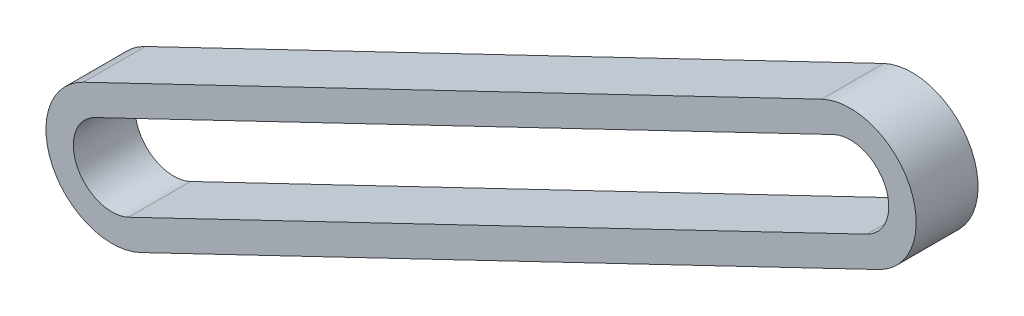
ISO-10303-21;
HEADER;
FILE_DESCRIPTION(('STEP AP214'),'2;1');
FILE_NAME('part.step','',(''),(''),'','','');
FILE_SCHEMA(('AUTOMOTIVE_DESIGN { 1 0 10303 214 1 1 1 1 }'));
ENDSEC;
DATA;
#1=APPLICATION_CONTEXT('core data for automotive mechanical design processes');
#2=APPLICATION_PROTOCOL_DEFINITION('international standard','automotive_design',2000,#1);
#3=PRODUCT_CONTEXT('',#1,'mechanical');
#4=PRODUCT('Part','Part','',(#3));
#5=PRODUCT_RELATED_PRODUCT_CATEGORY('part','',(#4));
#6=PRODUCT_DEFINITION_FORMATION('','',#4);
#7=PRODUCT_DEFINITION_CONTEXT('part definition',#1,'design');
#8=PRODUCT_DEFINITION('design','',#6,#7);
#9=PRODUCT_DEFINITION_SHAPE('','',#8);
#10=(LENGTH_UNIT() NAMED_UNIT(*) SI_UNIT(.MILLI.,.METRE.));
#11=(NAMED_UNIT(*) PLANE_ANGLE_UNIT() SI_UNIT($,.RADIAN.));
#12=(NAMED_UNIT(*) SI_UNIT($,.STERADIAN.) SOLID_ANGLE_UNIT());
#13=UNCERTAINTY_MEASURE_WITH_UNIT(LENGTH_MEASURE(1.E-05),#10,'distance_accuracy_value','');
#14=(GEOMETRIC_REPRESENTATION_CONTEXT(3) GLOBAL_UNCERTAINTY_ASSIGNED_CONTEXT((#13)) GLOBAL_UNIT_ASSIGNED_CONTEXT((#10,
#11,#12)) REPRESENTATION_CONTEXT('',''));
#15=CARTESIAN_POINT('',(0.,0.,0.));
#16=DIRECTION('',(0.,0.,1.));
#17=DIRECTION('',(1.,0.,0.));
#18=AXIS2_PLACEMENT_3D('',#15,#16,#17);
#19=CARTESIAN_POINT('',(0.,0.,-3.));
#20=DIRECTION('',(0.,0.,1.));
#21=DIRECTION('',(1.,0.,0.));
#22=AXIS2_PLACEMENT_3D('',#19,#20,#21);
#23=CYLINDRICAL_SURFACE('',#22,3.2);
#24=CARTESIAN_POINT('',(0.,0.,0.));
#25=DIRECTION('',(0.,0.,1.));
#26=DIRECTION('',(1.,0.,0.));
#27=AXIS2_PLACEMENT_3D('',#24,#25,#26);
#28=CIRCLE('',#27,3.2);
#29=CARTESIAN_POINT('',(-1.38491820855128,2.88478795678696,0.));
#30=VERTEX_POINT('',#29);
#31=CARTESIAN_POINT('',(1.38491820855131,-2.88478795678695,0.));
#32=VERTEX_POINT('',#31);
#33=EDGE_CURVE('E135',#30,#32,#28,.T.);
#34=ORIENTED_EDGE('',*,*,#33,.F.);
#35=DIRECTION('',(0.,0.,1.));
#36=VECTOR('',#35,1.);
#37=CARTESIAN_POINT('',(-1.38491820855128,2.88478795678696,-3.));
#38=LINE('',#37,#36);
#39=CARTESIAN_POINT('',(-1.38491820855128,2.88478795678696,-3.));
#40=VERTEX_POINT('',#39);
#41=EDGE_CURVE('E11',#40,#30,#38,.T.);
#42=ORIENTED_EDGE('',*,*,#41,.F.);
#43=CARTESIAN_POINT('',(0.,0.,-3.));
#44=DIRECTION('',(0.,0.,1.));
#45=DIRECTION('',(1.,0.,0.));
#46=AXIS2_PLACEMENT_3D('',#43,#44,#45);
#47=CIRCLE('',#46,3.2);
#48=CARTESIAN_POINT('',(1.38491820855131,-2.88478795678695,-3.));
#49=VERTEX_POINT('',#48);
#50=EDGE_CURVE('E139',#40,#49,#47,.T.);
#51=ORIENTED_EDGE('',*,*,#50,.T.);
#52=DIRECTION('',(0.,0.,1.));
#53=VECTOR('',#52,1.);
#54=CARTESIAN_POINT('',(1.38491820855131,-2.88478795678695,-3.));
#55=LINE('',#54,#53);
#56=EDGE_CURVE('E40',#49,#32,#55,.T.);
#57=ORIENTED_EDGE('',*,*,#56,.T.);
#58=EDGE_LOOP('',(#34,#42,#51,#57));
#59=FACE_BOUND('',#58,.T.);
#60=ADVANCED_FACE('F37',(#59),#23,.T.);
#61=CARTESIAN_POINT('',(-1.38491820855128,2.88478795678696,-3.));
#62=DIRECTION('',(-0.43278694017228,0.901496236495925,0.));
#63=DIRECTION('',(-0.901496236495925,-0.43278694017228,0.));
#64=AXIS2_PLACEMENT_3D('',#61,#62,#63);
#65=PLANE('',#64);
#66=DIRECTION('',(-0.901496236495924,-0.432786940172279,0.));
#67=VECTOR('',#66,1.);
#68=CARTESIAN_POINT('',(-1.38491820855128,2.88478795678696,0.));
#69=LINE('',#68,#67);
#70=CARTESIAN_POINT('',(34.4150817914487,20.0715180072542,0.));
#71=VERTEX_POINT('',#70);
#72=EDGE_CURVE('E143',#71,#30,#69,.T.);
#73=ORIENTED_EDGE('',*,*,#72,.F.);
#74=DIRECTION('',(0.,0.,1.));
#75=VECTOR('',#74,1.);
#76=CARTESIAN_POINT('',(34.4150817914487,20.0715180072542,-3.));
#77=LINE('',#76,#75);
#78=CARTESIAN_POINT('',(34.4150817914487,20.0715180072542,-3.));
#79=VERTEX_POINT('',#78);
#80=EDGE_CURVE('E45',#79,#71,#77,.T.);
#81=ORIENTED_EDGE('',*,*,#80,.F.);
#82=DIRECTION('',(-0.901496236495924,-0.432786940172279,0.));
#83=VECTOR('',#82,1.);
#84=CARTESIAN_POINT('',(-1.38491820855128,2.88478795678696,-3.));
#85=LINE('',#84,#83);
#86=EDGE_CURVE('E149',#79,#40,#85,.T.);
#87=ORIENTED_EDGE('',*,*,#86,.T.);
#88=ORIENTED_EDGE('',*,*,#41,.T.);
#89=EDGE_LOOP('',(#73,#81,#87,#88));
#90=FACE_BOUND('',#89,.T.);
#91=ADVANCED_FACE('F175',(#90),#65,.T.);
#92=CARTESIAN_POINT('',(35.8,17.1867300504672,-3.));
#93=DIRECTION('',(0.,0.,1.));
#94=DIRECTION('',(1.,0.,0.));
#95=AXIS2_PLACEMENT_3D('',#92,#93,#94);
#96=CYLINDRICAL_SURFACE('',#95,3.2);
#97=CARTESIAN_POINT('',(35.8,17.1867300504672,0.));
#98=DIRECTION('',(0.,0.,1.));
#99=DIRECTION('',(1.,0.,0.));
#100=AXIS2_PLACEMENT_3D('',#97,#98,#99);
#101=CIRCLE('',#100,3.2);
#102=CARTESIAN_POINT('',(37.1849182085513,14.3019420936803,0.));
#103=VERTEX_POINT('',#102);
#104=EDGE_CURVE('E157',#103,#71,#101,.T.);
#105=ORIENTED_EDGE('',*,*,#104,.F.);
#106=DIRECTION('',(0.,0.,1.));
#107=VECTOR('',#106,1.);
#108=CARTESIAN_POINT('',(37.1849182085513,14.3019420936803,-3.));
#109=LINE('',#108,#107);
#110=CARTESIAN_POINT('',(37.1849182085513,14.3019420936803,-3.));
#111=VERTEX_POINT('',#110);
#112=EDGE_CURVE('E162',#111,#103,#109,.T.);
#113=ORIENTED_EDGE('',*,*,#112,.F.);
#114=CARTESIAN_POINT('',(35.8,17.1867300504672,-3.));
#115=DIRECTION('',(0.,0.,1.));
#116=DIRECTION('',(1.,0.,0.));
#117=AXIS2_PLACEMENT_3D('',#114,#115,#116);
#118=CIRCLE('',#117,3.2);
#119=EDGE_CURVE('E146',#111,#79,#118,.T.);
#120=ORIENTED_EDGE('',*,*,#119,.T.);
#121=ORIENTED_EDGE('',*,*,#80,.T.);
#122=EDGE_LOOP('',(#105,#113,#120,#121));
#123=FACE_BOUND('',#122,.T.);
#124=ADVANCED_FACE('F179',(#123),#96,.T.);
#125=CARTESIAN_POINT('',(1.38491820855131,-2.88478795678695,-3.));
#126=DIRECTION('',(0.43278694017228,-0.901496236495924,0.));
#127=DIRECTION('',(0.901496236495925,0.43278694017228,0.));
#128=AXIS2_PLACEMENT_3D('',#125,#126,#127);
#129=PLANE('',#128);
#130=DIRECTION('',(0.901496236495924,0.43278694017228,0.));
#131=VECTOR('',#130,1.);
#132=CARTESIAN_POINT('',(1.38491820855131,-2.88478795678695,0.));
#133=LINE('',#132,#131);
#134=EDGE_CURVE('E154',#32,#103,#133,.T.);
#135=ORIENTED_EDGE('',*,*,#134,.F.);
#136=ORIENTED_EDGE('',*,*,#56,.F.);
#137=DIRECTION('',(0.901496236495924,0.43278694017228,0.));
#138=VECTOR('',#137,1.);
#139=CARTESIAN_POINT('',(1.38491820855131,-2.88478795678695,-3.));
#140=LINE('',#139,#138);
#141=EDGE_CURVE('E142',#49,#111,#140,.T.);
#142=ORIENTED_EDGE('',*,*,#141,.T.);
#143=ORIENTED_EDGE('',*,*,#112,.T.);
#144=EDGE_LOOP('',(#135,#136,#142,#143));
#145=FACE_BOUND('',#144,.T.);
#146=ADVANCED_FACE('F170',(#145),#129,.T.);
#147=CARTESIAN_POINT('',(0.,0.,-3.));
#148=DIRECTION('',(0.,0.,1.));
#149=DIRECTION('',(1.,0.,0.));
#150=AXIS2_PLACEMENT_3D('',#147,#148,#149);
#151=PLANE('',#150);
#152=DIRECTION('',(-0.901496236495924,-0.43278694017228,0.));
#153=VECTOR('',#152,1.);
#154=CARTESIAN_POINT('',(-0.810177152002494,1.68760095472038,-3.));
#155=LINE('',#154,#153);
#156=CARTESIAN_POINT('',(34.9898228479975,18.8743310051876,-3.));
#157=VERTEX_POINT('',#156);
#158=CARTESIAN_POINT('',(-0.810177152002494,1.68760095472038,-3.));
#159=VERTEX_POINT('',#158);
#160=EDGE_CURVE('E110',#157,#159,#155,.T.);
#161=ORIENTED_EDGE('',*,*,#160,.T.);
#162=CARTESIAN_POINT('',(0.,0.,-3.));
#163=DIRECTION('',(0.,0.,1.));
#164=DIRECTION('',(1.,0.,0.));
#165=AXIS2_PLACEMENT_3D('',#162,#163,#164);
#166=CIRCLE('',#165,1.872);
#167=CARTESIAN_POINT('',(0.81017715200252,-1.68760095472036,-3.));
#168=VERTEX_POINT('',#167);
#169=EDGE_CURVE('E104',#159,#168,#166,.T.);
#170=ORIENTED_EDGE('',*,*,#169,.T.);
#171=DIRECTION('',(0.901496236495924,0.432786940172279,0.));
#172=VECTOR('',#171,1.);
#173=CARTESIAN_POINT('',(0.81017715200252,-1.68760095472036,-3.));
#174=LINE('',#173,#172);
#175=CARTESIAN_POINT('',(36.6101771520025,15.4991290957468,-3.));
#176=VERTEX_POINT('',#175);
#177=EDGE_CURVE('E113',#168,#176,#174,.T.);
#178=ORIENTED_EDGE('',*,*,#177,.T.);
#179=CARTESIAN_POINT('',(35.8,17.1867300504672,-3.));
#180=DIRECTION('',(0.,0.,1.));
#181=DIRECTION('',(1.,0.,0.));
#182=AXIS2_PLACEMENT_3D('',#179,#180,#181);
#183=CIRCLE('',#182,1.872);
#184=EDGE_CURVE('E53',#176,#157,#183,.T.);
#185=ORIENTED_EDGE('',*,*,#184,.T.);
#186=EDGE_LOOP('',(#161,#170,#178,#185));
#187=FACE_BOUND('',#186,.T.);
#188=ORIENTED_EDGE('',*,*,#50,.F.);
#189=ORIENTED_EDGE('',*,*,#86,.F.);
#190=ORIENTED_EDGE('',*,*,#119,.F.);
#191=ORIENTED_EDGE('',*,*,#141,.F.);
#192=EDGE_LOOP('',(#188,#189,#190,#191));
#193=FACE_BOUND('',#192,.T.);
#194=ADVANCED_FACE('F117',(#187,#193),#151,.F.);
#195=CARTESIAN_POINT('',(0.,0.,0.));
#196=DIRECTION('',(0.,0.,1.));
#197=DIRECTION('',(1.,0.,0.));
#198=AXIS2_PLACEMENT_3D('',#195,#196,#197);
#199=PLANE('',#198);
#200=CARTESIAN_POINT('',(0.,0.,0.));
#201=DIRECTION('',(0.,0.,1.));
#202=DIRECTION('',(1.,0.,0.));
#203=AXIS2_PLACEMENT_3D('',#200,#201,#202);
#204=CIRCLE('',#203,1.872);
#205=CARTESIAN_POINT('',(-0.810177152002494,1.68760095472038,0.));
#206=VERTEX_POINT('',#205);
#207=CARTESIAN_POINT('',(0.81017715200252,-1.68760095472036,0.));
#208=VERTEX_POINT('',#207);
#209=EDGE_CURVE('E61',#206,#208,#204,.T.);
#210=ORIENTED_EDGE('',*,*,#209,.F.);
#211=DIRECTION('',(-0.901496236495924,-0.43278694017228,0.));
#212=VECTOR('',#211,1.);
#213=CARTESIAN_POINT('',(-0.810177152002494,1.68760095472038,0.));
#214=LINE('',#213,#212);
#215=CARTESIAN_POINT('',(34.9898228479975,18.8743310051876,0.));
#216=VERTEX_POINT('',#215);
#217=EDGE_CURVE('E120',#216,#206,#214,.T.);
#218=ORIENTED_EDGE('',*,*,#217,.F.);
#219=CARTESIAN_POINT('',(35.8,17.1867300504672,0.));
#220=DIRECTION('',(0.,0.,1.));
#221=DIRECTION('',(1.,0.,0.));
#222=AXIS2_PLACEMENT_3D('',#219,#220,#221);
#223=CIRCLE('',#222,1.872);
#224=CARTESIAN_POINT('',(36.6101771520025,15.4991290957469,0.));
#225=VERTEX_POINT('',#224);
#226=EDGE_CURVE('E123',#225,#216,#223,.T.);
#227=ORIENTED_EDGE('',*,*,#226,.F.);
#228=DIRECTION('',(0.901496236495924,0.432786940172279,0.));
#229=VECTOR('',#228,1.);
#230=CARTESIAN_POINT('',(0.81017715200252,-1.68760095472036,0.));
#231=LINE('',#230,#229);
#232=EDGE_CURVE('E129',#208,#225,#231,.T.);
#233=ORIENTED_EDGE('',*,*,#232,.F.);
#234=EDGE_LOOP('',(#210,#218,#227,#233));
#235=FACE_BOUND('',#234,.T.);
#236=ORIENTED_EDGE('',*,*,#33,.T.);
#237=ORIENTED_EDGE('',*,*,#134,.T.);
#238=ORIENTED_EDGE('',*,*,#104,.T.);
#239=ORIENTED_EDGE('',*,*,#72,.T.);
#240=EDGE_LOOP('',(#236,#237,#238,#239));
#241=FACE_BOUND('',#240,.T.);
#242=ADVANCED_FACE('F172',(#235,#241),#199,.T.);
#243=CARTESIAN_POINT('',(0.,0.,-3.));
#244=DIRECTION('',(0.,0.,1.));
#245=DIRECTION('',(1.,0.,0.));
#246=AXIS2_PLACEMENT_3D('',#243,#244,#245);
#247=CYLINDRICAL_SURFACE('',#246,1.872);
#248=ORIENTED_EDGE('',*,*,#209,.T.);
#249=DIRECTION('',(0.,0.,1.));
#250=VECTOR('',#249,1.);
#251=CARTESIAN_POINT('',(0.81017715200252,-1.68760095472036,-3.));
#252=LINE('',#251,#250);
#253=EDGE_CURVE('E100',#168,#208,#252,.T.);
#254=ORIENTED_EDGE('',*,*,#253,.F.);
#255=ORIENTED_EDGE('',*,*,#169,.F.);
#256=DIRECTION('',(0.,0.,1.));
#257=VECTOR('',#256,1.);
#258=CARTESIAN_POINT('',(-0.810177152002494,1.68760095472038,-3.));
#259=LINE('',#258,#257);
#260=EDGE_CURVE('E133',#159,#206,#259,.T.);
#261=ORIENTED_EDGE('',*,*,#260,.T.);
#262=EDGE_LOOP('',(#248,#254,#255,#261));
#263=FACE_BOUND('',#262,.T.);
#264=ADVANCED_FACE('F102',(#263),#247,.F.);
#265=CARTESIAN_POINT('',(-0.810177152002494,1.68760095472038,-3.));
#266=DIRECTION('',(-0.43278694017228,0.901496236495924,0.));
#267=DIRECTION('',(-0.901496236495925,-0.43278694017228,0.));
#268=AXIS2_PLACEMENT_3D('',#265,#266,#267);
#269=PLANE('',#268);
#270=ORIENTED_EDGE('',*,*,#217,.T.);
#271=ORIENTED_EDGE('',*,*,#260,.F.);
#272=ORIENTED_EDGE('',*,*,#160,.F.);
#273=DIRECTION('',(0.,0.,1.));
#274=VECTOR('',#273,1.);
#275=CARTESIAN_POINT('',(34.9898228479975,18.8743310051876,-3.));
#276=LINE('',#275,#274);
#277=EDGE_CURVE('E136',#157,#216,#276,.T.);
#278=ORIENTED_EDGE('',*,*,#277,.T.);
#279=EDGE_LOOP('',(#270,#271,#272,#278));
#280=FACE_BOUND('',#279,.T.);
#281=ADVANCED_FACE('F232',(#280),#269,.F.);
#282=CARTESIAN_POINT('',(35.8,17.1867300504672,-3.));
#283=DIRECTION('',(0.,0.,1.));
#284=DIRECTION('',(1.,0.,0.));
#285=AXIS2_PLACEMENT_3D('',#282,#283,#284);
#286=CYLINDRICAL_SURFACE('',#285,1.872);
#287=ORIENTED_EDGE('',*,*,#226,.T.);
#288=ORIENTED_EDGE('',*,*,#277,.F.);
#289=ORIENTED_EDGE('',*,*,#184,.F.);
#290=DIRECTION('',(0.,0.,1.));
#291=VECTOR('',#290,1.);
#292=CARTESIAN_POINT('',(36.6101771520025,15.4991290957469,-3.));
#293=LINE('',#292,#291);
#294=EDGE_CURVE('E109',#176,#225,#293,.T.);
#295=ORIENTED_EDGE('',*,*,#294,.T.);
#296=EDGE_LOOP('',(#287,#288,#289,#295));
#297=FACE_BOUND('',#296,.T.);
#298=ADVANCED_FACE('F241',(#297),#286,.F.);
#299=CARTESIAN_POINT('',(0.81017715200252,-1.68760095472036,-3.));
#300=DIRECTION('',(0.43278694017228,-0.901496236495925,0.));
#301=DIRECTION('',(0.901496236495925,0.43278694017228,0.));
#302=AXIS2_PLACEMENT_3D('',#299,#300,#301);
#303=PLANE('',#302);
#304=ORIENTED_EDGE('',*,*,#232,.T.);
#305=ORIENTED_EDGE('',*,*,#294,.F.);
#306=ORIENTED_EDGE('',*,*,#177,.F.);
#307=ORIENTED_EDGE('',*,*,#253,.T.);
#308=EDGE_LOOP('',(#304,#305,#306,#307));
#309=FACE_BOUND('',#308,.T.);
#310=ADVANCED_FACE('F114',(#309),#303,.F.);
#311=CLOSED_SHELL('',(#60,#91,#124,#146,#194,#242,#264,#281,#298,#310));
#312=MANIFOLD_SOLID_BREP('B2',#311);
#313=ADVANCED_BREP_SHAPE_REPRESENTATION('',(#18,#312),#14);
#314=SHAPE_DEFINITION_REPRESENTATION(#9,#313);
ENDSEC;
END-ISO-10303-21;
